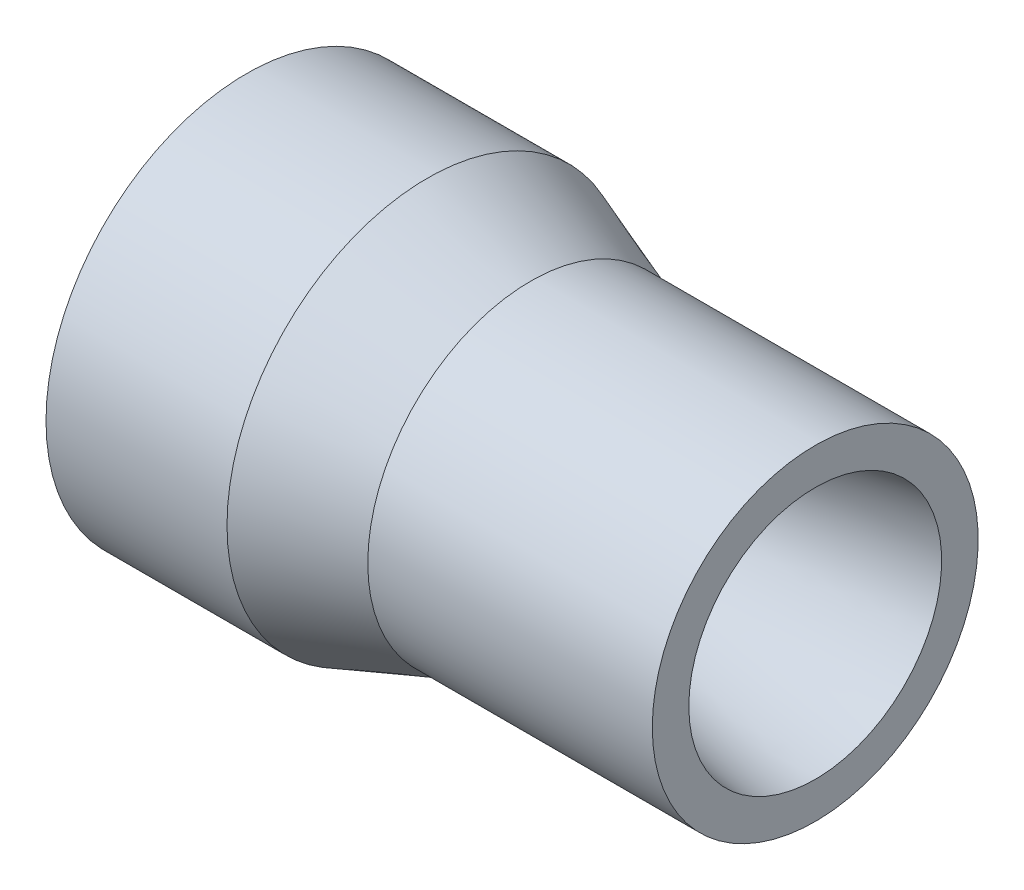
ISO-10303-21;
HEADER;
FILE_DESCRIPTION(('STEP AP214'),'2;1');
FILE_NAME('part.step','',(''),(''),'','','');
FILE_SCHEMA(('AUTOMOTIVE_DESIGN { 1 0 10303 214 1 1 1 1 }'));
ENDSEC;
DATA;
#1=APPLICATION_CONTEXT('core data for automotive mechanical design processes');
#2=APPLICATION_PROTOCOL_DEFINITION('international standard','automotive_design',2000,#1);
#3=PRODUCT_CONTEXT('',#1,'mechanical');
#4=PRODUCT('Part','Part','',(#3));
#5=PRODUCT_RELATED_PRODUCT_CATEGORY('part','',(#4));
#6=PRODUCT_DEFINITION_FORMATION('','',#4);
#7=PRODUCT_DEFINITION_CONTEXT('part definition',#1,'design');
#8=PRODUCT_DEFINITION('design','',#6,#7);
#9=PRODUCT_DEFINITION_SHAPE('','',#8);
#10=(LENGTH_UNIT() NAMED_UNIT(*) SI_UNIT(.MILLI.,.METRE.));
#11=(NAMED_UNIT(*) PLANE_ANGLE_UNIT() SI_UNIT($,.RADIAN.));
#12=(NAMED_UNIT(*) SI_UNIT($,.STERADIAN.) SOLID_ANGLE_UNIT());
#13=UNCERTAINTY_MEASURE_WITH_UNIT(LENGTH_MEASURE(1.E-05),#10,'distance_accuracy_value','');
#14=(GEOMETRIC_REPRESENTATION_CONTEXT(3) GLOBAL_UNCERTAINTY_ASSIGNED_CONTEXT((#13)) GLOBAL_UNIT_ASSIGNED_CONTEXT((#10,
#11,#12)) REPRESENTATION_CONTEXT('',''));
#15=CARTESIAN_POINT('',(0.,0.,0.));
#16=DIRECTION('',(0.,0.,1.));
#17=DIRECTION('',(1.,0.,0.));
#18=AXIS2_PLACEMENT_3D('',#15,#16,#17);
#19=CARTESIAN_POINT('',(-2.79521626221381,0.,0.));
#20=DIRECTION('',(-1.,0.,0.));
#21=DIRECTION('',(0.,0.,1.));
#22=AXIS2_PLACEMENT_3D('',#19,#20,#21);
#23=DEGENERATE_TOROIDAL_SURFACE('',#22,42.7018551138408,85.61,.F.);
#24=CARTESIAN_POINT('',(40.0097837377863,0.,0.));
#25=DIRECTION('',(-1.,0.,0.));
#26=DIRECTION('',(0.,0.,1.));
#27=AXIS2_PLACEMENT_3D('',#24,#25,#26);
#28=CIRCLE('',#27,31.4385797041449);
#29=CARTESIAN_POINT('',(40.0097837377863,0.,31.4385797041449));
#30=VERTEX_POINT('',#29);
#31=EDGE_CURVE('E75',#30,#30,#28,.T.);
#32=ORIENTED_EDGE('',*,*,#31,.F.);
#33=EDGE_LOOP('',(#32));
#34=FACE_BOUND('',#33,.T.);
#35=CARTESIAN_POINT('',(0.,0.,0.));
#36=DIRECTION('',(-1.,0.,0.));
#37=DIRECTION('',(0.,0.,1.));
#38=AXIS2_PLACEMENT_3D('',#35,#36,#37);
#39=CIRCLE('',#38,42.8625);
#40=CARTESIAN_POINT('',(0.,0.,42.8625));
#41=VERTEX_POINT('',#40);
#42=EDGE_CURVE('E10',#41,#41,#39,.T.);
#43=ORIENTED_EDGE('',*,*,#42,.T.);
#44=EDGE_LOOP('',(#43));
#45=FACE_BOUND('',#44,.T.);
#46=ADVANCED_FACE('F39',(#34,#45),#23,.T.);
#47=CARTESIAN_POINT('',(0.,42.8625,0.));
#48=DIRECTION('',(1.,0.,0.));
#49=DIRECTION('',(0.,0.,-1.));
#50=AXIS2_PLACEMENT_3D('',#47,#48,#49);
#51=PLANE('',#50);
#52=ORIENTED_EDGE('',*,*,#42,.F.);
#53=EDGE_LOOP('',(#52));
#54=FACE_BOUND('',#53,.T.);
#55=CARTESIAN_POINT('',(0.,0.,0.));
#56=DIRECTION('',(-1.,0.,0.));
#57=DIRECTION('',(0.,0.,1.));
#58=AXIS2_PLACEMENT_3D('',#55,#56,#57);
#59=CIRCLE('',#58,52.2986);
#60=CARTESIAN_POINT('',(0.,0.,52.2986));
#61=VERTEX_POINT('',#60);
#62=EDGE_CURVE('E46',#61,#61,#59,.T.);
#63=ORIENTED_EDGE('',*,*,#62,.T.);
#64=EDGE_LOOP('',(#63));
#65=FACE_BOUND('',#64,.T.);
#66=ADVANCED_FACE('F106',(#54,#65),#51,.F.);
#67=CARTESIAN_POINT('',(0.,0.,0.));
#68=DIRECTION('',(-1.,0.,0.));
#69=DIRECTION('',(0.,0.,1.));
#70=AXIS2_PLACEMENT_3D('',#67,#68,#69);
#71=CYLINDRICAL_SURFACE('',#70,52.2986);
#72=ORIENTED_EDGE('',*,*,#62,.F.);
#73=EDGE_LOOP('',(#72));
#74=FACE_BOUND('',#73,.T.);
#75=CARTESIAN_POINT('',(47.208567757732,0.,0.));
#76=DIRECTION('',(-1.,0.,0.));
#77=DIRECTION('',(0.,0.,1.));
#78=AXIS2_PLACEMENT_3D('',#75,#76,#77);
#79=CIRCLE('',#78,52.2986);
#80=CARTESIAN_POINT('',(47.208567757732,0.,52.2986));
#81=VERTEX_POINT('',#80);
#82=EDGE_CURVE('E51',#81,#81,#79,.T.);
#83=ORIENTED_EDGE('',*,*,#82,.T.);
#84=EDGE_LOOP('',(#83));
#85=FACE_BOUND('',#84,.T.);
#86=ADVANCED_FACE('F103',(#74,#85),#71,.T.);
#87=CARTESIAN_POINT('',(74.13,0.,0.));
#88=DIRECTION('',(-1.,0.,0.));
#89=DIRECTION('',(0.,0.,1.));
#90=AXIS2_PLACEMENT_3D('',#87,#88,#89);
#91=CONICAL_SURFACE('',#90,42.5,0.349065850398867);
#92=ORIENTED_EDGE('',*,*,#82,.F.);
#93=EDGE_LOOP('',(#92));
#94=FACE_BOUND('',#93,.T.);
#95=CARTESIAN_POINT('',(74.13,0.,0.));
#96=DIRECTION('',(-1.,0.,0.));
#97=DIRECTION('',(0.,0.,1.));
#98=AXIS2_PLACEMENT_3D('',#95,#96,#97);
#99=CIRCLE('',#98,42.5);
#100=CARTESIAN_POINT('',(74.13,0.,42.5));
#101=VERTEX_POINT('',#100);
#102=EDGE_CURVE('E55',#101,#101,#99,.T.);
#103=ORIENTED_EDGE('',*,*,#102,.T.);
#104=EDGE_LOOP('',(#103));
#105=FACE_BOUND('',#104,.T.);
#106=ADVANCED_FACE('F99',(#94,#105),#91,.T.);
#107=CARTESIAN_POINT('',(0.,0.,0.));
#108=DIRECTION('',(-1.,0.,0.));
#109=DIRECTION('',(0.,0.,1.));
#110=AXIS2_PLACEMENT_3D('',#107,#108,#109);
#111=CYLINDRICAL_SURFACE('',#110,42.5);
#112=ORIENTED_EDGE('',*,*,#102,.F.);
#113=EDGE_LOOP('',(#112));
#114=FACE_BOUND('',#113,.T.);
#115=CARTESIAN_POINT('',(148.34,0.,0.));
#116=DIRECTION('',(-1.,0.,0.));
#117=DIRECTION('',(0.,0.,1.));
#118=AXIS2_PLACEMENT_3D('',#115,#116,#117);
#119=CIRCLE('',#118,42.5);
#120=CARTESIAN_POINT('',(148.34,0.,42.5));
#121=VERTEX_POINT('',#120);
#122=EDGE_CURVE('E60',#121,#121,#119,.T.);
#123=ORIENTED_EDGE('',*,*,#122,.T.);
#124=EDGE_LOOP('',(#123));
#125=FACE_BOUND('',#124,.T.);
#126=ADVANCED_FACE('F95',(#114,#125),#111,.T.);
#127=CARTESIAN_POINT('',(148.34,32.975,0.));
#128=DIRECTION('',(-1.,0.,0.));
#129=DIRECTION('',(0.,0.,1.));
#130=AXIS2_PLACEMENT_3D('',#127,#128,#129);
#131=PLANE('',#130);
#132=ORIENTED_EDGE('',*,*,#122,.F.);
#133=EDGE_LOOP('',(#132));
#134=FACE_BOUND('',#133,.T.);
#135=CARTESIAN_POINT('',(148.34,0.,0.));
#136=DIRECTION('',(-1.,0.,0.));
#137=DIRECTION('',(0.,0.,1.));
#138=AXIS2_PLACEMENT_3D('',#135,#136,#137);
#139=CIRCLE('',#138,32.975);
#140=CARTESIAN_POINT('',(148.34,0.,32.975));
#141=VERTEX_POINT('',#140);
#142=EDGE_CURVE('E63',#141,#141,#139,.T.);
#143=ORIENTED_EDGE('',*,*,#142,.T.);
#144=EDGE_LOOP('',(#143));
#145=FACE_BOUND('',#144,.T.);
#146=ADVANCED_FACE('F90',(#134,#145),#131,.F.);
#147=CARTESIAN_POINT('',(76.0448047049782,15.6078337942569,0.));
#148=CARTESIAN_POINT('',(97.2352372555907,22.9622506153776,0.));
#149=CARTESIAN_POINT('',(126.012294014913,29.8370455638665,0.));
#150=CARTESIAN_POINT('',(148.34,32.975,0.));
#151=B_SPLINE_CURVE_WITH_KNOTS('',3,(#147,#148,#149,#150),.UNSPECIFIED.,.F.,.F.,(4,4),(0.,1.),.UNSPECIFIED.);
#152=CARTESIAN_POINT('',(0.,0.,0.));
#153=DIRECTION('',(-1.,0.,0.));
#154=AXIS1_PLACEMENT('',#152,#153);
#155=SURFACE_OF_REVOLUTION('',#151,#154);
#156=ORIENTED_EDGE('',*,*,#142,.F.);
#157=EDGE_LOOP('',(#156));
#158=FACE_BOUND('',#157,.T.);
#159=CARTESIAN_POINT('',(76.0448047049782,0.,0.));
#160=DIRECTION('',(-1.,0.,0.));
#161=DIRECTION('',(0.,0.,1.));
#162=AXIS2_PLACEMENT_3D('',#159,#160,#161);
#163=CIRCLE('',#162,15.6078337942569);
#164=CARTESIAN_POINT('',(76.0448047049782,0.,15.6078337942569));
#165=VERTEX_POINT('',#164);
#166=EDGE_CURVE('E66',#165,#165,#163,.T.);
#167=ORIENTED_EDGE('',*,*,#166,.T.);
#168=EDGE_LOOP('',(#167));
#169=FACE_BOUND('',#168,.T.);
#170=ADVANCED_FACE('F85',(#158,#169),#155,.T.);
#171=CARTESIAN_POINT('',(74.13,0.,0.));
#172=DIRECTION('',(-1.,0.,0.));
#173=DIRECTION('',(0.,0.,1.));
#174=AXIS2_PLACEMENT_3D('',#171,#172,#173);
#175=TOROIDAL_SURFACE('',#174,21.125,5.84);
#176=ORIENTED_EDGE('',*,*,#166,.F.);
#177=EDGE_LOOP('',(#176));
#178=FACE_BOUND('',#177,.T.);
#179=CARTESIAN_POINT('',(74.13,0.,0.));
#180=DIRECTION('',(-1.,0.,0.));
#181=DIRECTION('',(0.,0.,1.));
#182=AXIS2_PLACEMENT_3D('',#179,#180,#181);
#183=CIRCLE('',#182,15.285);
#184=CARTESIAN_POINT('',(74.13,0.,15.285));
#185=VERTEX_POINT('',#184);
#186=EDGE_CURVE('E69',#185,#185,#183,.T.);
#187=ORIENTED_EDGE('',*,*,#186,.T.);
#188=EDGE_LOOP('',(#187));
#189=FACE_BOUND('',#188,.T.);
#190=ADVANCED_FACE('F89',(#178,#189),#175,.T.);
#191=CARTESIAN_POINT('',(74.13,0.,0.));
#192=DIRECTION('',(-1.,0.,0.));
#193=DIRECTION('',(0.,0.,1.));
#194=AXIS2_PLACEMENT_3D('',#191,#192,#193);
#195=TOROIDAL_SURFACE('',#194,38.205,22.92);
#196=ORIENTED_EDGE('',*,*,#186,.F.);
#197=EDGE_LOOP('',(#196));
#198=FACE_BOUND('',#197,.T.);
#199=CARTESIAN_POINT('',(62.67,0.,0.));
#200=DIRECTION('',(-1.,0.,0.));
#201=DIRECTION('',(0.,0.,1.));
#202=AXIS2_PLACEMENT_3D('',#199,#200,#201);
#203=CIRCLE('',#202,18.3556977452607);
#204=CARTESIAN_POINT('',(62.67,0.,18.3556977452607));
#205=VERTEX_POINT('',#204);
#206=EDGE_CURVE('E72',#205,#205,#203,.T.);
#207=ORIENTED_EDGE('',*,*,#206,.T.);
#208=EDGE_LOOP('',(#207));
#209=FACE_BOUND('',#208,.T.);
#210=ADVANCED_FACE('F120',(#198,#209),#195,.T.);
#211=CARTESIAN_POINT('',(40.0097837377863,0.,0.));
#212=DIRECTION('',(-1.,0.,0.));
#213=DIRECTION('',(0.,0.,1.));
#214=AXIS2_PLACEMENT_3D('',#211,#212,#213);
#215=CONICAL_SURFACE('',#214,31.4385797041449,0.523598775598301);
#216=ORIENTED_EDGE('',*,*,#206,.F.);
#217=EDGE_LOOP('',(#216));
#218=FACE_BOUND('',#217,.T.);
#219=ORIENTED_EDGE('',*,*,#31,.T.);
#220=EDGE_LOOP('',(#219));
#221=FACE_BOUND('',#220,.T.);
#222=ADVANCED_FACE('F118',(#218,#221),#215,.F.);
#223=CLOSED_SHELL('',(#46,#66,#86,#106,#126,#146,#170,#190,#210,#222));
#224=MANIFOLD_SOLID_BREP('B2',#223);
#225=ADVANCED_BREP_SHAPE_REPRESENTATION('',(#18,#224),#14);
#226=SHAPE_DEFINITION_REPRESENTATION(#9,#225);
ENDSEC;
END-ISO-10303-21;
